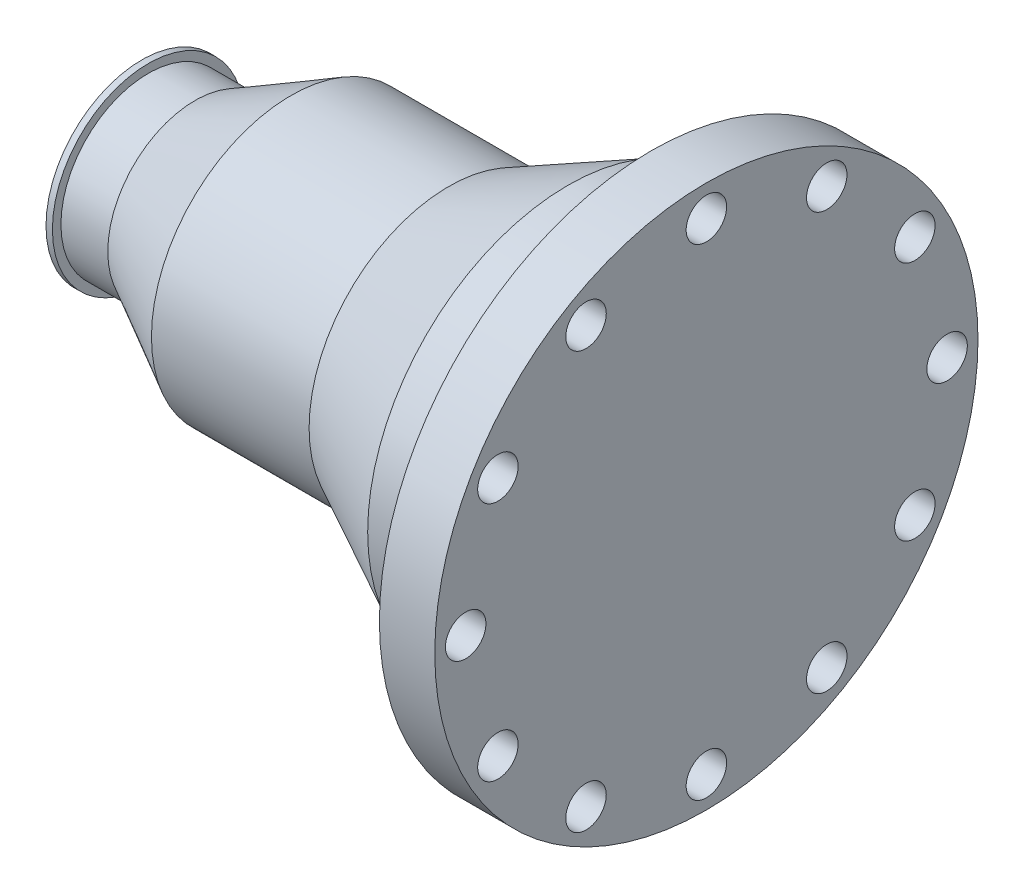
ISO-10303-21;
HEADER;
FILE_DESCRIPTION(('STEP AP214'),'2;1');
FILE_NAME('part.step','',(''),(''),'','','');
FILE_SCHEMA(('AUTOMOTIVE_DESIGN { 1 0 10303 214 1 1 1 1 }'));
ENDSEC;
DATA;
#1=APPLICATION_CONTEXT('core data for automotive mechanical design processes');
#2=APPLICATION_PROTOCOL_DEFINITION('international standard','automotive_design',2000,#1);
#3=PRODUCT_CONTEXT('',#1,'mechanical');
#4=PRODUCT('Part','Part','',(#3));
#5=PRODUCT_RELATED_PRODUCT_CATEGORY('part','',(#4));
#6=PRODUCT_DEFINITION_FORMATION('','',#4);
#7=PRODUCT_DEFINITION_CONTEXT('part definition',#1,'design');
#8=PRODUCT_DEFINITION('design','',#6,#7);
#9=PRODUCT_DEFINITION_SHAPE('','',#8);
#10=(LENGTH_UNIT() NAMED_UNIT(*) SI_UNIT(.MILLI.,.METRE.));
#11=(NAMED_UNIT(*) PLANE_ANGLE_UNIT() SI_UNIT($,.RADIAN.));
#12=(NAMED_UNIT(*) SI_UNIT($,.STERADIAN.) SOLID_ANGLE_UNIT());
#13=UNCERTAINTY_MEASURE_WITH_UNIT(LENGTH_MEASURE(1.E-05),#10,'distance_accuracy_value','');
#14=(GEOMETRIC_REPRESENTATION_CONTEXT(3) GLOBAL_UNCERTAINTY_ASSIGNED_CONTEXT((#13)) GLOBAL_UNIT_ASSIGNED_CONTEXT((#10,
#11,#12)) REPRESENTATION_CONTEXT('',''));
#15=CARTESIAN_POINT('',(0.,0.,0.));
#16=DIRECTION('',(0.,0.,1.));
#17=DIRECTION('',(1.,0.,0.));
#18=AXIS2_PLACEMENT_3D('',#15,#16,#17);
#19=CARTESIAN_POINT('',(0.,0.,0.));
#20=DIRECTION('',(1.,0.,0.));
#21=DIRECTION('',(0.,0.,-1.));
#22=AXIS2_PLACEMENT_3D('',#19,#20,#21);
#23=PLANE('',#22);
#24=CARTESIAN_POINT('',(0.,0.,0.));
#25=DIRECTION('',(-1.,0.,0.));
#26=DIRECTION('',(0.,0.,1.));
#27=AXIS2_PLACEMENT_3D('',#24,#25,#26);
#28=CIRCLE('',#27,31.);
#29=CARTESIAN_POINT('',(0.,0.,31.));
#30=VERTEX_POINT('',#29);
#31=EDGE_CURVE('E80',#30,#30,#28,.T.);
#32=ORIENTED_EDGE('',*,*,#31,.F.);
#33=EDGE_LOOP('',(#32));
#34=FACE_BOUND('',#33,.T.);
#35=CARTESIAN_POINT('',(0.,0.,0.));
#36=DIRECTION('',(-1.,0.,0.));
#37=DIRECTION('',(0.,0.,1.));
#38=AXIS2_PLACEMENT_3D('',#35,#36,#37);
#39=CIRCLE('',#38,45.);
#40=CARTESIAN_POINT('',(0.,0.,45.));
#41=VERTEX_POINT('',#40);
#42=EDGE_CURVE('E10',#41,#41,#39,.T.);
#43=ORIENTED_EDGE('',*,*,#42,.T.);
#44=EDGE_LOOP('',(#43));
#45=FACE_BOUND('',#44,.T.);
#46=ADVANCED_FACE('F37',(#34,#45),#23,.F.);
#47=CARTESIAN_POINT('',(0.,0.,0.));
#48=DIRECTION('',(-1.,0.,0.));
#49=DIRECTION('',(0.,0.,1.));
#50=AXIS2_PLACEMENT_3D('',#47,#48,#49);
#51=CYLINDRICAL_SURFACE('',#50,45.);
#52=ORIENTED_EDGE('',*,*,#42,.F.);
#53=EDGE_LOOP('',(#52));
#54=FACE_BOUND('',#53,.T.);
#55=CARTESIAN_POINT('',(3.,0.,0.));
#56=DIRECTION('',(-1.,0.,0.));
#57=DIRECTION('',(0.,0.,1.));
#58=AXIS2_PLACEMENT_3D('',#55,#56,#57);
#59=CIRCLE('',#58,45.);
#60=CARTESIAN_POINT('',(3.,0.,45.));
#61=VERTEX_POINT('',#60);
#62=EDGE_CURVE('E43',#61,#61,#59,.T.);
#63=ORIENTED_EDGE('',*,*,#62,.T.);
#64=EDGE_LOOP('',(#63));
#65=FACE_BOUND('',#64,.T.);
#66=ADVANCED_FACE('F226',(#54,#65),#51,.T.);
#67=CARTESIAN_POINT('',(3.,45.,0.));
#68=DIRECTION('',(-1.,0.,0.));
#69=DIRECTION('',(0.,0.,1.));
#70=AXIS2_PLACEMENT_3D('',#67,#68,#69);
#71=PLANE('',#70);
#72=ORIENTED_EDGE('',*,*,#62,.F.);
#73=EDGE_LOOP('',(#72));
#74=FACE_BOUND('',#73,.T.);
#75=CARTESIAN_POINT('',(3.,0.,0.));
#76=DIRECTION('',(-1.,0.,0.));
#77=DIRECTION('',(0.,0.,1.));
#78=AXIS2_PLACEMENT_3D('',#75,#76,#77);
#79=CIRCLE('',#78,41.);
#80=CARTESIAN_POINT('',(3.,0.,41.));
#81=VERTEX_POINT('',#80);
#82=EDGE_CURVE('E47',#81,#81,#79,.T.);
#83=ORIENTED_EDGE('',*,*,#82,.T.);
#84=EDGE_LOOP('',(#83));
#85=FACE_BOUND('',#84,.T.);
#86=ADVANCED_FACE('F232',(#74,#85),#71,.F.);
#87=CARTESIAN_POINT('',(0.,0.,0.));
#88=DIRECTION('',(-1.,0.,0.));
#89=DIRECTION('',(0.,0.,1.));
#90=AXIS2_PLACEMENT_3D('',#87,#88,#89);
#91=CYLINDRICAL_SURFACE('',#90,41.);
#92=ORIENTED_EDGE('',*,*,#82,.F.);
#93=EDGE_LOOP('',(#92));
#94=FACE_BOUND('',#93,.T.);
#95=CARTESIAN_POINT('',(25.,0.,0.));
#96=DIRECTION('',(-1.,0.,0.));
#97=DIRECTION('',(0.,0.,1.));
#98=AXIS2_PLACEMENT_3D('',#95,#96,#97);
#99=CIRCLE('',#98,41.);
#100=CARTESIAN_POINT('',(25.,0.,41.));
#101=VERTEX_POINT('',#100);
#102=EDGE_CURVE('E51',#101,#101,#99,.T.);
#103=ORIENTED_EDGE('',*,*,#102,.T.);
#104=EDGE_LOOP('',(#103));
#105=FACE_BOUND('',#104,.T.);
#106=ADVANCED_FACE('F514',(#94,#105),#91,.T.);
#107=CARTESIAN_POINT('',(70.,0.,0.));
#108=DIRECTION('',(1.,0.,0.));
#109=DIRECTION('',(0.,0.,-1.));
#110=AXIS2_PLACEMENT_3D('',#107,#108,#109);
#111=CONICAL_SURFACE('',#110,65.5,0.498567905638218);
#112=ORIENTED_EDGE('',*,*,#102,.F.);
#113=EDGE_LOOP('',(#112));
#114=FACE_BOUND('',#113,.T.);
#115=CARTESIAN_POINT('',(70.,0.,0.));
#116=DIRECTION('',(-1.,0.,0.));
#117=DIRECTION('',(0.,0.,1.));
#118=AXIS2_PLACEMENT_3D('',#115,#116,#117);
#119=CIRCLE('',#118,65.5);
#120=CARTESIAN_POINT('',(70.,0.,65.5));
#121=VERTEX_POINT('',#120);
#122=EDGE_CURVE('E56',#121,#121,#119,.T.);
#123=ORIENTED_EDGE('',*,*,#122,.T.);
#124=EDGE_LOOP('',(#123));
#125=FACE_BOUND('',#124,.T.);
#126=ADVANCED_FACE('F505',(#114,#125),#111,.T.);
#127=CARTESIAN_POINT('',(0.,0.,0.));
#128=DIRECTION('',(-1.,0.,0.));
#129=DIRECTION('',(0.,0.,1.));
#130=AXIS2_PLACEMENT_3D('',#127,#128,#129);
#131=CYLINDRICAL_SURFACE('',#130,65.5);
#132=ORIENTED_EDGE('',*,*,#122,.F.);
#133=EDGE_LOOP('',(#132));
#134=FACE_BOUND('',#133,.T.);
#135=CARTESIAN_POINT('',(144.,0.,0.));
#136=DIRECTION('',(-1.,0.,0.));
#137=DIRECTION('',(0.,0.,1.));
#138=AXIS2_PLACEMENT_3D('',#135,#136,#137);
#139=CIRCLE('',#138,65.5);
#140=CARTESIAN_POINT('',(144.,0.,65.5));
#141=VERTEX_POINT('',#140);
#142=EDGE_CURVE('E59',#141,#141,#139,.T.);
#143=ORIENTED_EDGE('',*,*,#142,.T.);
#144=EDGE_LOOP('',(#143));
#145=FACE_BOUND('',#144,.T.);
#146=ADVANCED_FACE('F496',(#134,#145),#131,.T.);
#147=CARTESIAN_POINT('',(200.,0.,0.));
#148=DIRECTION('',(1.,0.,0.));
#149=DIRECTION('',(0.,0.,-1.));
#150=AXIS2_PLACEMENT_3D('',#147,#148,#149);
#151=CONICAL_SURFACE('',#150,94.,0.470764926542016);
#152=ORIENTED_EDGE('',*,*,#142,.F.);
#153=EDGE_LOOP('',(#152));
#154=FACE_BOUND('',#153,.T.);
#155=CARTESIAN_POINT('',(200.,0.,0.));
#156=DIRECTION('',(-1.,0.,0.));
#157=DIRECTION('',(0.,0.,1.));
#158=AXIS2_PLACEMENT_3D('',#155,#156,#157);
#159=CIRCLE('',#158,94.);
#160=CARTESIAN_POINT('',(200.,0.,94.));
#161=VERTEX_POINT('',#160);
#162=EDGE_CURVE('E62',#161,#161,#159,.T.);
#163=ORIENTED_EDGE('',*,*,#162,.T.);
#164=EDGE_LOOP('',(#163));
#165=FACE_BOUND('',#164,.T.);
#166=ADVANCED_FACE('F487',(#154,#165),#151,.T.);
#167=CARTESIAN_POINT('',(0.,0.,0.));
#168=DIRECTION('',(-1.,0.,0.));
#169=DIRECTION('',(0.,0.,1.));
#170=AXIS2_PLACEMENT_3D('',#167,#168,#169);
#171=CYLINDRICAL_SURFACE('',#170,94.);
#172=ORIENTED_EDGE('',*,*,#162,.F.);
#173=EDGE_LOOP('',(#172));
#174=FACE_BOUND('',#173,.T.);
#175=CARTESIAN_POINT('',(220.,0.,0.));
#176=DIRECTION('',(-1.,0.,0.));
#177=DIRECTION('',(0.,0.,1.));
#178=AXIS2_PLACEMENT_3D('',#175,#176,#177);
#179=CIRCLE('',#178,94.);
#180=CARTESIAN_POINT('',(220.,0.,94.));
#181=VERTEX_POINT('',#180);
#182=EDGE_CURVE('E65',#181,#181,#179,.T.);
#183=ORIENTED_EDGE('',*,*,#182,.T.);
#184=EDGE_LOOP('',(#183));
#185=FACE_BOUND('',#184,.T.);
#186=ADVANCED_FACE('F478',(#174,#185),#171,.T.);
#187=CARTESIAN_POINT('',(220.,94.,0.));
#188=DIRECTION('',(1.,0.,0.));
#189=DIRECTION('',(0.,0.,-1.));
#190=AXIS2_PLACEMENT_3D('',#187,#188,#189);
#191=PLANE('',#190);
#192=ORIENTED_EDGE('',*,*,#182,.F.);
#193=EDGE_LOOP('',(#192));
#194=FACE_BOUND('',#193,.T.);
#195=CARTESIAN_POINT('',(220.,0.,0.));
#196=DIRECTION('',(-1.,0.,0.));
#197=DIRECTION('',(0.,0.,1.));
#198=AXIS2_PLACEMENT_3D('',#195,#196,#197);
#199=CIRCLE('',#198,95.);
#200=CARTESIAN_POINT('',(220.,0.,95.));
#201=VERTEX_POINT('',#200);
#202=EDGE_CURVE('E68',#201,#201,#199,.T.);
#203=ORIENTED_EDGE('',*,*,#202,.T.);
#204=EDGE_LOOP('',(#203));
#205=FACE_BOUND('',#204,.T.);
#206=ADVANCED_FACE('F469',(#194,#205),#191,.F.);
#207=CARTESIAN_POINT('',(0.,0.,0.));
#208=DIRECTION('',(-1.,0.,0.));
#209=DIRECTION('',(0.,0.,1.));
#210=AXIS2_PLACEMENT_3D('',#207,#208,#209);
#211=CYLINDRICAL_SURFACE('',#210,95.);
#212=ORIENTED_EDGE('',*,*,#202,.F.);
#213=EDGE_LOOP('',(#212));
#214=FACE_BOUND('',#213,.T.);
#215=CARTESIAN_POINT('',(239.,0.,0.));
#216=DIRECTION('',(-1.,0.,0.));
#217=DIRECTION('',(0.,0.,1.));
#218=AXIS2_PLACEMENT_3D('',#215,#216,#217);
#219=CIRCLE('',#218,95.);
#220=CARTESIAN_POINT('',(239.,0.,95.));
#221=VERTEX_POINT('',#220);
#222=EDGE_CURVE('E71',#221,#221,#219,.T.);
#223=ORIENTED_EDGE('',*,*,#222,.T.);
#224=EDGE_LOOP('',(#223));
#225=FACE_BOUND('',#224,.T.);
#226=ADVANCED_FACE('F222',(#214,#225),#211,.T.);
#227=CARTESIAN_POINT('',(239.,100.,0.));
#228=DIRECTION('',(1.,0.,0.));
#229=DIRECTION('',(0.,0.,-1.));
#230=AXIS2_PLACEMENT_3D('',#227,#228,#229);
#231=PLANE('',#230);
#232=CARTESIAN_POINT('',(239.,97.8608706276416,-56.5));
#233=DIRECTION('',(1.,0.,0.));
#234=DIRECTION('',(0.,0.,-1.));
#235=AXIS2_PLACEMENT_3D('',#232,#233,#234);
#236=CIRCLE('',#235,9.50000000000001);
#237=CARTESIAN_POINT('',(239.,97.8608706276416,-66.));
#238=VERTEX_POINT('',#237);
#239=EDGE_CURVE('E173',#238,#238,#236,.F.);
#240=ORIENTED_EDGE('',*,*,#239,.F.);
#241=EDGE_LOOP('',(#240));
#242=FACE_BOUND('',#241,.T.);
#243=CARTESIAN_POINT('',(239.,56.4999999999999,-97.8608706276416));
#244=DIRECTION('',(1.,0.,0.));
#245=DIRECTION('',(0.,0.,-1.));
#246=AXIS2_PLACEMENT_3D('',#243,#244,#245);
#247=CIRCLE('',#246,9.5);
#248=CARTESIAN_POINT('',(239.,56.4999999999999,-107.360870627642));
#249=VERTEX_POINT('',#248);
#250=EDGE_CURVE('E167',#249,#249,#247,.F.);
#251=ORIENTED_EDGE('',*,*,#250,.F.);
#252=EDGE_LOOP('',(#251));
#253=FACE_BOUND('',#252,.T.);
#254=CARTESIAN_POINT('',(239.,0.,-113.));
#255=DIRECTION('',(1.,0.,0.));
#256=DIRECTION('',(0.,0.,-1.));
#257=AXIS2_PLACEMENT_3D('',#254,#255,#256);
#258=CIRCLE('',#257,9.49999999999999);
#259=CARTESIAN_POINT('',(239.,0.,-122.5));
#260=VERTEX_POINT('',#259);
#261=EDGE_CURVE('E161',#260,#260,#258,.F.);
#262=ORIENTED_EDGE('',*,*,#261,.F.);
#263=EDGE_LOOP('',(#262));
#264=FACE_BOUND('',#263,.T.);
#265=CARTESIAN_POINT('',(239.,-56.5,-97.8608706276415));
#266=DIRECTION('',(1.,0.,0.));
#267=DIRECTION('',(0.,0.,-1.));
#268=AXIS2_PLACEMENT_3D('',#265,#266,#267);
#269=CIRCLE('',#268,9.5);
#270=CARTESIAN_POINT('',(239.,-56.5,-107.360870627642));
#271=VERTEX_POINT('',#270);
#272=EDGE_CURVE('E155',#271,#271,#269,.F.);
#273=ORIENTED_EDGE('',*,*,#272,.F.);
#274=EDGE_LOOP('',(#273));
#275=FACE_BOUND('',#274,.T.);
#276=CARTESIAN_POINT('',(239.,-97.8608706276416,-56.5));
#277=DIRECTION('',(1.,0.,0.));
#278=DIRECTION('',(0.,0.,-1.));
#279=AXIS2_PLACEMENT_3D('',#276,#277,#278);
#280=CIRCLE('',#279,9.50000000000001);
#281=CARTESIAN_POINT('',(239.,-97.8608706276416,-66.));
#282=VERTEX_POINT('',#281);
#283=EDGE_CURVE('E149',#282,#282,#280,.F.);
#284=ORIENTED_EDGE('',*,*,#283,.F.);
#285=EDGE_LOOP('',(#284));
#286=FACE_BOUND('',#285,.T.);
#287=CARTESIAN_POINT('',(239.,-113.,0.));
#288=DIRECTION('',(1.,0.,0.));
#289=DIRECTION('',(0.,0.,-1.));
#290=AXIS2_PLACEMENT_3D('',#287,#288,#289);
#291=CIRCLE('',#290,9.49999999999998);
#292=CARTESIAN_POINT('',(239.,-113.,-9.49999999999998));
#293=VERTEX_POINT('',#292);
#294=EDGE_CURVE('E143',#293,#293,#291,.F.);
#295=ORIENTED_EDGE('',*,*,#294,.F.);
#296=EDGE_LOOP('',(#295));
#297=FACE_BOUND('',#296,.T.);
#298=CARTESIAN_POINT('',(239.,-97.8608706276415,56.5));
#299=DIRECTION('',(1.,0.,0.));
#300=DIRECTION('',(0.,0.,-1.));
#301=AXIS2_PLACEMENT_3D('',#298,#299,#300);
#302=CIRCLE('',#301,9.5);
#303=CARTESIAN_POINT('',(239.,-97.8608706276415,47.));
#304=VERTEX_POINT('',#303);
#305=EDGE_CURVE('E137',#304,#304,#302,.F.);
#306=ORIENTED_EDGE('',*,*,#305,.F.);
#307=EDGE_LOOP('',(#306));
#308=FACE_BOUND('',#307,.T.);
#309=CARTESIAN_POINT('',(239.,-56.5,97.8608706276416));
#310=DIRECTION('',(1.,0.,0.));
#311=DIRECTION('',(0.,0.,-1.));
#312=AXIS2_PLACEMENT_3D('',#309,#310,#311);
#313=CIRCLE('',#312,9.5);
#314=CARTESIAN_POINT('',(239.,-56.5,88.3608706276416));
#315=VERTEX_POINT('',#314);
#316=EDGE_CURVE('E131',#315,#315,#313,.F.);
#317=ORIENTED_EDGE('',*,*,#316,.F.);
#318=EDGE_LOOP('',(#317));
#319=FACE_BOUND('',#318,.T.);
#320=CARTESIAN_POINT('',(239.,0.,113.));
#321=DIRECTION('',(1.,0.,0.));
#322=DIRECTION('',(0.,0.,-1.));
#323=AXIS2_PLACEMENT_3D('',#320,#321,#322);
#324=CIRCLE('',#323,9.49999999999999);
#325=CARTESIAN_POINT('',(239.,0.,103.5));
#326=VERTEX_POINT('',#325);
#327=EDGE_CURVE('E125',#326,#326,#324,.F.);
#328=ORIENTED_EDGE('',*,*,#327,.F.);
#329=EDGE_LOOP('',(#328));
#330=FACE_BOUND('',#329,.T.);
#331=CARTESIAN_POINT('',(239.,56.5,97.8608706276416));
#332=DIRECTION('',(1.,0.,0.));
#333=DIRECTION('',(0.,0.,-1.));
#334=AXIS2_PLACEMENT_3D('',#331,#332,#333);
#335=CIRCLE('',#334,9.5);
#336=CARTESIAN_POINT('',(239.,56.5,88.3608706276416));
#337=VERTEX_POINT('',#336);
#338=EDGE_CURVE('E119',#337,#337,#335,.F.);
#339=ORIENTED_EDGE('',*,*,#338,.F.);
#340=EDGE_LOOP('',(#339));
#341=FACE_BOUND('',#340,.T.);
#342=CARTESIAN_POINT('',(239.,97.8608706276416,56.5));
#343=DIRECTION('',(1.,0.,0.));
#344=DIRECTION('',(0.,0.,-1.));
#345=AXIS2_PLACEMENT_3D('',#342,#343,#344);
#346=CIRCLE('',#345,9.5);
#347=CARTESIAN_POINT('',(239.,97.8608706276416,47.));
#348=VERTEX_POINT('',#347);
#349=EDGE_CURVE('E113',#348,#348,#346,.F.);
#350=ORIENTED_EDGE('',*,*,#349,.F.);
#351=EDGE_LOOP('',(#350));
#352=FACE_BOUND('',#351,.T.);
#353=CARTESIAN_POINT('',(239.,113.,0.));
#354=DIRECTION('',(1.,0.,0.));
#355=DIRECTION('',(0.,0.,-1.));
#356=AXIS2_PLACEMENT_3D('',#353,#354,#355);
#357=CIRCLE('',#356,9.50000000000001);
#358=CARTESIAN_POINT('',(239.,113.,-9.50000000000001));
#359=VERTEX_POINT('',#358);
#360=EDGE_CURVE('E107',#359,#359,#357,.F.);
#361=ORIENTED_EDGE('',*,*,#360,.F.);
#362=EDGE_LOOP('',(#361));
#363=FACE_BOUND('',#362,.T.);
#364=ORIENTED_EDGE('',*,*,#222,.F.);
#365=EDGE_LOOP('',(#364));
#366=FACE_BOUND('',#365,.T.);
#367=CARTESIAN_POINT('',(239.,0.,0.));
#368=DIRECTION('',(-1.,0.,0.));
#369=DIRECTION('',(0.,0.,1.));
#370=AXIS2_PLACEMENT_3D('',#367,#368,#369);
#371=CIRCLE('',#370,127.5);
#372=CARTESIAN_POINT('',(239.,0.,127.5));
#373=VERTEX_POINT('',#372);
#374=EDGE_CURVE('E74',#373,#373,#371,.T.);
#375=ORIENTED_EDGE('',*,*,#374,.T.);
#376=EDGE_LOOP('',(#375));
#377=FACE_BOUND('',#376,.T.);
#378=ADVANCED_FACE('F214',(#242,#253,#264,#275,#286,#297,#308,#319,#330,#341,#352,#363,#366,
#377),#231,.F.);
#379=CARTESIAN_POINT('',(0.,0.,0.));
#380=DIRECTION('',(-1.,0.,0.));
#381=DIRECTION('',(0.,0.,1.));
#382=AXIS2_PLACEMENT_3D('',#379,#380,#381);
#383=CYLINDRICAL_SURFACE('',#382,127.5);
#384=ORIENTED_EDGE('',*,*,#374,.F.);
#385=EDGE_LOOP('',(#384));
#386=FACE_BOUND('',#385,.T.);
#387=CARTESIAN_POINT('',(265.,0.,0.));
#388=DIRECTION('',(-1.,0.,0.));
#389=DIRECTION('',(0.,0.,1.));
#390=AXIS2_PLACEMENT_3D('',#387,#388,#389);
#391=CIRCLE('',#390,127.5);
#392=CARTESIAN_POINT('',(265.,0.,127.5));
#393=VERTEX_POINT('',#392);
#394=EDGE_CURVE('E77',#393,#393,#391,.T.);
#395=ORIENTED_EDGE('',*,*,#394,.T.);
#396=EDGE_LOOP('',(#395));
#397=FACE_BOUND('',#396,.T.);
#398=ADVANCED_FACE('F187',(#386,#397),#383,.T.);
#399=CARTESIAN_POINT('',(265.,127.5,0.));
#400=DIRECTION('',(-1.,0.,0.));
#401=DIRECTION('',(0.,0.,1.));
#402=AXIS2_PLACEMENT_3D('',#399,#400,#401);
#403=PLANE('',#402);
#404=CARTESIAN_POINT('',(265.,97.8608706276416,-56.5));
#405=DIRECTION('',(1.,0.,0.));
#406=DIRECTION('',(0.,0.,-1.));
#407=AXIS2_PLACEMENT_3D('',#404,#405,#406);
#408=CIRCLE('',#407,9.50000000000001);
#409=CARTESIAN_POINT('',(265.,97.8608706276416,-66.));
#410=VERTEX_POINT('',#409);
#411=EDGE_CURVE('E176',#410,#410,#408,.T.);
#412=ORIENTED_EDGE('',*,*,#411,.F.);
#413=EDGE_LOOP('',(#412));
#414=FACE_BOUND('',#413,.T.);
#415=CARTESIAN_POINT('',(265.,56.4999999999999,-97.8608706276416));
#416=DIRECTION('',(1.,0.,0.));
#417=DIRECTION('',(0.,0.,-1.));
#418=AXIS2_PLACEMENT_3D('',#415,#416,#417);
#419=CIRCLE('',#418,9.5);
#420=CARTESIAN_POINT('',(265.,56.4999999999999,-107.360870627642));
#421=VERTEX_POINT('',#420);
#422=EDGE_CURVE('E170',#421,#421,#419,.T.);
#423=ORIENTED_EDGE('',*,*,#422,.F.);
#424=EDGE_LOOP('',(#423));
#425=FACE_BOUND('',#424,.T.);
#426=CARTESIAN_POINT('',(265.,0.,-113.));
#427=DIRECTION('',(1.,0.,0.));
#428=DIRECTION('',(0.,0.,-1.));
#429=AXIS2_PLACEMENT_3D('',#426,#427,#428);
#430=CIRCLE('',#429,9.49999999999999);
#431=CARTESIAN_POINT('',(265.,0.,-122.5));
#432=VERTEX_POINT('',#431);
#433=EDGE_CURVE('E164',#432,#432,#430,.T.);
#434=ORIENTED_EDGE('',*,*,#433,.F.);
#435=EDGE_LOOP('',(#434));
#436=FACE_BOUND('',#435,.T.);
#437=CARTESIAN_POINT('',(265.,-56.5,-97.8608706276415));
#438=DIRECTION('',(1.,0.,0.));
#439=DIRECTION('',(0.,0.,-1.));
#440=AXIS2_PLACEMENT_3D('',#437,#438,#439);
#441=CIRCLE('',#440,9.5);
#442=CARTESIAN_POINT('',(265.,-56.5,-107.360870627642));
#443=VERTEX_POINT('',#442);
#444=EDGE_CURVE('E158',#443,#443,#441,.T.);
#445=ORIENTED_EDGE('',*,*,#444,.F.);
#446=EDGE_LOOP('',(#445));
#447=FACE_BOUND('',#446,.T.);
#448=CARTESIAN_POINT('',(265.,-97.8608706276416,-56.5));
#449=DIRECTION('',(1.,0.,0.));
#450=DIRECTION('',(0.,0.,-1.));
#451=AXIS2_PLACEMENT_3D('',#448,#449,#450);
#452=CIRCLE('',#451,9.50000000000001);
#453=CARTESIAN_POINT('',(265.,-97.8608706276416,-66.));
#454=VERTEX_POINT('',#453);
#455=EDGE_CURVE('E152',#454,#454,#452,.T.);
#456=ORIENTED_EDGE('',*,*,#455,.F.);
#457=EDGE_LOOP('',(#456));
#458=FACE_BOUND('',#457,.T.);
#459=CARTESIAN_POINT('',(265.,-113.,0.));
#460=DIRECTION('',(1.,0.,0.));
#461=DIRECTION('',(0.,0.,-1.));
#462=AXIS2_PLACEMENT_3D('',#459,#460,#461);
#463=CIRCLE('',#462,9.49999999999998);
#464=CARTESIAN_POINT('',(265.,-113.,-9.49999999999998));
#465=VERTEX_POINT('',#464);
#466=EDGE_CURVE('E146',#465,#465,#463,.T.);
#467=ORIENTED_EDGE('',*,*,#466,.F.);
#468=EDGE_LOOP('',(#467));
#469=FACE_BOUND('',#468,.T.);
#470=CARTESIAN_POINT('',(265.,-97.8608706276415,56.5));
#471=DIRECTION('',(1.,0.,0.));
#472=DIRECTION('',(0.,0.,-1.));
#473=AXIS2_PLACEMENT_3D('',#470,#471,#472);
#474=CIRCLE('',#473,9.5);
#475=CARTESIAN_POINT('',(265.,-97.8608706276415,47.));
#476=VERTEX_POINT('',#475);
#477=EDGE_CURVE('E140',#476,#476,#474,.T.);
#478=ORIENTED_EDGE('',*,*,#477,.F.);
#479=EDGE_LOOP('',(#478));
#480=FACE_BOUND('',#479,.T.);
#481=CARTESIAN_POINT('',(265.,-56.5,97.8608706276416));
#482=DIRECTION('',(1.,0.,0.));
#483=DIRECTION('',(0.,0.,-1.));
#484=AXIS2_PLACEMENT_3D('',#481,#482,#483);
#485=CIRCLE('',#484,9.5);
#486=CARTESIAN_POINT('',(265.,-56.5,88.3608706276416));
#487=VERTEX_POINT('',#486);
#488=EDGE_CURVE('E134',#487,#487,#485,.T.);
#489=ORIENTED_EDGE('',*,*,#488,.F.);
#490=EDGE_LOOP('',(#489));
#491=FACE_BOUND('',#490,.T.);
#492=CARTESIAN_POINT('',(265.,0.,113.));
#493=DIRECTION('',(1.,0.,0.));
#494=DIRECTION('',(0.,0.,-1.));
#495=AXIS2_PLACEMENT_3D('',#492,#493,#494);
#496=CIRCLE('',#495,9.49999999999999);
#497=CARTESIAN_POINT('',(265.,0.,103.5));
#498=VERTEX_POINT('',#497);
#499=EDGE_CURVE('E128',#498,#498,#496,.T.);
#500=ORIENTED_EDGE('',*,*,#499,.F.);
#501=EDGE_LOOP('',(#500));
#502=FACE_BOUND('',#501,.T.);
#503=CARTESIAN_POINT('',(265.,56.5,97.8608706276416));
#504=DIRECTION('',(1.,0.,0.));
#505=DIRECTION('',(0.,0.,-1.));
#506=AXIS2_PLACEMENT_3D('',#503,#504,#505);
#507=CIRCLE('',#506,9.5);
#508=CARTESIAN_POINT('',(265.,56.5,88.3608706276416));
#509=VERTEX_POINT('',#508);
#510=EDGE_CURVE('E122',#509,#509,#507,.T.);
#511=ORIENTED_EDGE('',*,*,#510,.F.);
#512=EDGE_LOOP('',(#511));
#513=FACE_BOUND('',#512,.T.);
#514=CARTESIAN_POINT('',(265.,97.8608706276416,56.5));
#515=DIRECTION('',(1.,0.,0.));
#516=DIRECTION('',(0.,0.,-1.));
#517=AXIS2_PLACEMENT_3D('',#514,#515,#516);
#518=CIRCLE('',#517,9.5);
#519=CARTESIAN_POINT('',(265.,97.8608706276416,47.));
#520=VERTEX_POINT('',#519);
#521=EDGE_CURVE('E116',#520,#520,#518,.T.);
#522=ORIENTED_EDGE('',*,*,#521,.F.);
#523=EDGE_LOOP('',(#522));
#524=FACE_BOUND('',#523,.T.);
#525=CARTESIAN_POINT('',(265.,113.,0.));
#526=DIRECTION('',(1.,0.,0.));
#527=DIRECTION('',(0.,0.,-1.));
#528=AXIS2_PLACEMENT_3D('',#525,#526,#527);
#529=CIRCLE('',#528,9.50000000000001);
#530=CARTESIAN_POINT('',(265.,113.,-9.50000000000001));
#531=VERTEX_POINT('',#530);
#532=EDGE_CURVE('E110',#531,#531,#529,.T.);
#533=ORIENTED_EDGE('',*,*,#532,.F.);
#534=EDGE_LOOP('',(#533));
#535=FACE_BOUND('',#534,.T.);
#536=ORIENTED_EDGE('',*,*,#394,.F.);
#537=EDGE_LOOP('',(#536));
#538=FACE_BOUND('',#537,.T.);
#539=ADVANCED_FACE('F183',(#414,#425,#436,#447,#458,#469,#480,#491,#502,#513,#524,#535,#538),
#403,.F.);
#540=CARTESIAN_POINT('',(0.,0.,0.));
#541=DIRECTION('',(-1.,0.,0.));
#542=DIRECTION('',(0.,0.,1.));
#543=AXIS2_PLACEMENT_3D('',#540,#541,#542);
#544=CYLINDRICAL_SURFACE('',#543,31.);
#545=ORIENTED_EDGE('',*,*,#31,.T.);
#546=EDGE_LOOP('',(#545));
#547=FACE_BOUND('',#546,.T.);
#548=CARTESIAN_POINT('',(42.,0.,0.));
#549=DIRECTION('',(-1.,0.,0.));
#550=DIRECTION('',(0.,0.,1.));
#551=AXIS2_PLACEMENT_3D('',#548,#549,#550);
#552=CIRCLE('',#551,31.);
#553=CARTESIAN_POINT('',(42.,0.,31.));
#554=VERTEX_POINT('',#553);
#555=EDGE_CURVE('E83',#554,#554,#552,.T.);
#556=ORIENTED_EDGE('',*,*,#555,.F.);
#557=EDGE_LOOP('',(#556));
#558=FACE_BOUND('',#557,.T.);
#559=ADVANCED_FACE('F186',(#547,#558),#544,.F.);
#560=CARTESIAN_POINT('',(70.,0.,0.));
#561=DIRECTION('',(1.,0.,0.));
#562=DIRECTION('',(0.,0.,-1.));
#563=AXIS2_PLACEMENT_3D('',#560,#561,#562);
#564=CONICAL_SURFACE('',#563,38.502577,0.261799374867879);
#565=ORIENTED_EDGE('',*,*,#555,.T.);
#566=EDGE_LOOP('',(#565));
#567=FACE_BOUND('',#566,.T.);
#568=CARTESIAN_POINT('',(70.,0.,0.));
#569=DIRECTION('',(-1.,0.,0.));
#570=DIRECTION('',(0.,0.,1.));
#571=AXIS2_PLACEMENT_3D('',#568,#569,#570);
#572=CIRCLE('',#571,38.502577);
#573=CARTESIAN_POINT('',(70.,0.,38.502577));
#574=VERTEX_POINT('',#573);
#575=EDGE_CURVE('E86',#574,#574,#572,.T.);
#576=ORIENTED_EDGE('',*,*,#575,.F.);
#577=EDGE_LOOP('',(#576));
#578=FACE_BOUND('',#577,.T.);
#579=ADVANCED_FACE('F237',(#567,#578),#564,.F.);
#580=CARTESIAN_POINT('',(107.802202951022,0.,0.));
#581=DIRECTION('',(-1.,0.,0.));
#582=DIRECTION('',(0.,0.,1.));
#583=AXIS2_PLACEMENT_3D('',#580,#581,#582);
#584=DEGENERATE_TOROIDAL_SURFACE('',#583,5.77654352226822,49.9999981513586,.T.);
#585=ORIENTED_EDGE('',*,*,#575,.T.);
#586=EDGE_LOOP('',(#585));
#587=FACE_BOUND('',#586,.T.);
#588=CARTESIAN_POINT('',(90.,0.,0.));
#589=DIRECTION('',(-1.,0.,0.));
#590=DIRECTION('',(0.,0.,1.));
#591=AXIS2_PLACEMENT_3D('',#588,#589,#590);
#592=CIRCLE('',#591,52.5);
#593=CARTESIAN_POINT('',(90.,0.,52.5));
#594=VERTEX_POINT('',#593);
#595=EDGE_CURVE('E89',#594,#594,#592,.T.);
#596=ORIENTED_EDGE('',*,*,#595,.F.);
#597=EDGE_LOOP('',(#596));
#598=FACE_BOUND('',#597,.T.);
#599=ADVANCED_FACE('F243',(#587,#598),#584,.F.);
#600=CARTESIAN_POINT('',(0.,0.,0.));
#601=DIRECTION('',(-1.,0.,0.));
#602=DIRECTION('',(0.,0.,1.));
#603=AXIS2_PLACEMENT_3D('',#600,#601,#602);
#604=CYLINDRICAL_SURFACE('',#603,52.5);
#605=ORIENTED_EDGE('',*,*,#595,.T.);
#606=EDGE_LOOP('',(#605));
#607=FACE_BOUND('',#606,.T.);
#608=CARTESIAN_POINT('',(142.,0.,0.));
#609=DIRECTION('',(-1.,0.,0.));
#610=DIRECTION('',(0.,0.,1.));
#611=AXIS2_PLACEMENT_3D('',#608,#609,#610);
#612=CIRCLE('',#611,52.5);
#613=CARTESIAN_POINT('',(142.,0.,52.5));
#614=VERTEX_POINT('',#613);
#615=EDGE_CURVE('E92',#614,#614,#612,.T.);
#616=ORIENTED_EDGE('',*,*,#615,.F.);
#617=EDGE_LOOP('',(#616));
#618=FACE_BOUND('',#617,.T.);
#619=ADVANCED_FACE('F249',(#607,#618),#604,.F.);
#620=CARTESIAN_POINT('',(142.75,0.,0.));
#621=DIRECTION('',(-1.,0.,0.));
#622=DIRECTION('',(0.,0.,1.));
#623=AXIS2_PLACEMENT_3D('',#620,#621,#622);
#624=TOROIDAL_SURFACE('',#623,49.8031848031275,2.79916276877255);
#625=ORIENTED_EDGE('',*,*,#615,.T.);
#626=EDGE_LOOP('',(#625));
#627=FACE_BOUND('',#626,.T.);
#628=CARTESIAN_POINT('',(143.5,0.,0.));
#629=DIRECTION('',(-1.,0.,0.));
#630=DIRECTION('',(0.,0.,1.));
#631=AXIS2_PLACEMENT_3D('',#628,#629,#630);
#632=CIRCLE('',#631,52.5);
#633=CARTESIAN_POINT('',(143.5,0.,52.5));
#634=VERTEX_POINT('',#633);
#635=EDGE_CURVE('E95',#634,#634,#632,.T.);
#636=ORIENTED_EDGE('',*,*,#635,.F.);
#637=EDGE_LOOP('',(#636));
#638=FACE_BOUND('',#637,.T.);
#639=ADVANCED_FACE('F255',(#627,#638),#624,.F.);
#640=CARTESIAN_POINT('',(0.,0.,0.));
#641=DIRECTION('',(-1.,0.,0.));
#642=DIRECTION('',(0.,0.,1.));
#643=AXIS2_PLACEMENT_3D('',#640,#641,#642);
#644=CYLINDRICAL_SURFACE('',#643,52.5);
#645=ORIENTED_EDGE('',*,*,#635,.T.);
#646=EDGE_LOOP('',(#645));
#647=FACE_BOUND('',#646,.T.);
#648=CARTESIAN_POINT('',(146.669872,0.,0.));
#649=DIRECTION('',(-1.,0.,0.));
#650=DIRECTION('',(0.,0.,1.));
#651=AXIS2_PLACEMENT_3D('',#648,#649,#650);
#652=CIRCLE('',#651,52.5);
#653=CARTESIAN_POINT('',(146.669872,0.,52.5));
#654=VERTEX_POINT('',#653);
#655=EDGE_CURVE('E98',#654,#654,#652,.T.);
#656=ORIENTED_EDGE('',*,*,#655,.F.);
#657=EDGE_LOOP('',(#656));
#658=FACE_BOUND('',#657,.T.);
#659=ADVANCED_FACE('F261',(#647,#658),#644,.F.);
#660=CARTESIAN_POINT('',(147.593438045,0.,0.));
#661=DIRECTION('',(-1.,0.,0.));
#662=DIRECTION('',(0.,0.,1.));
#663=AXIS2_PLACEMENT_3D('',#660,#661,#662);
#664=TOROIDAL_SURFACE('',#663,53.580573582,1.42148285448445);
#665=ORIENTED_EDGE('',*,*,#655,.T.);
#666=EDGE_LOOP('',(#665));
#667=FACE_BOUND('',#666,.T.);
#668=CARTESIAN_POINT('',(147.669872,0.,0.));
#669=DIRECTION('',(-1.,0.,0.));
#670=DIRECTION('',(0.,0.,1.));
#671=AXIS2_PLACEMENT_3D('',#668,#669,#670);
#672=CIRCLE('',#671,55.);
#673=CARTESIAN_POINT('',(147.669872,0.,55.));
#674=VERTEX_POINT('',#673);
#675=EDGE_CURVE('E101',#674,#674,#672,.T.);
#676=ORIENTED_EDGE('',*,*,#675,.F.);
#677=EDGE_LOOP('',(#676));
#678=FACE_BOUND('',#677,.T.);
#679=ADVANCED_FACE('F267',(#667,#678),#664,.F.);
#680=CARTESIAN_POINT('',(0.,0.,0.));
#681=DIRECTION('',(-1.,0.,0.));
#682=DIRECTION('',(0.,0.,1.));
#683=AXIS2_PLACEMENT_3D('',#680,#681,#682);
#684=CYLINDRICAL_SURFACE('',#683,55.);
#685=ORIENTED_EDGE('',*,*,#675,.T.);
#686=EDGE_LOOP('',(#685));
#687=FACE_BOUND('',#686,.T.);
#688=CARTESIAN_POINT('',(152.,0.,0.));
#689=DIRECTION('',(-1.,0.,0.));
#690=DIRECTION('',(0.,0.,1.));
#691=AXIS2_PLACEMENT_3D('',#688,#689,#690);
#692=CIRCLE('',#691,55.);
#693=CARTESIAN_POINT('',(152.,0.,55.));
#694=VERTEX_POINT('',#693);
#695=EDGE_CURVE('E104',#694,#694,#692,.T.);
#696=ORIENTED_EDGE('',*,*,#695,.F.);
#697=EDGE_LOOP('',(#696));
#698=FACE_BOUND('',#697,.T.);
#699=ADVANCED_FACE('F273',(#687,#698),#684,.F.);
#700=CARTESIAN_POINT('',(152.,55.,0.));
#701=DIRECTION('',(-1.,0.,0.));
#702=DIRECTION('',(0.,0.,1.));
#703=AXIS2_PLACEMENT_3D('',#700,#701,#702);
#704=PLANE('',#703);
#705=ORIENTED_EDGE('',*,*,#695,.T.);
#706=EDGE_LOOP('',(#705));
#707=FACE_BOUND('',#706,.T.);
#708=ADVANCED_FACE('F279',(#707),#704,.T.);
#709=CARTESIAN_POINT('',(265.,113.,0.));
#710=DIRECTION('',(-1.,0.,0.));
#711=DIRECTION('',(0.,0.,1.));
#712=AXIS2_PLACEMENT_3D('',#709,#710,#711);
#713=CYLINDRICAL_SURFACE('',#712,9.50000000000001);
#714=ORIENTED_EDGE('',*,*,#532,.T.);
#715=EDGE_LOOP('',(#714));
#716=FACE_BOUND('',#715,.T.);
#717=ORIENTED_EDGE('',*,*,#360,.T.);
#718=EDGE_LOOP('',(#717));
#719=FACE_BOUND('',#718,.T.);
#720=ADVANCED_FACE('F284',(#716,#719),#713,.F.);
#721=CARTESIAN_POINT('',(265.,97.8608706276416,56.5));
#722=DIRECTION('',(-1.,0.,0.));
#723=DIRECTION('',(0.,0.,1.));
#724=AXIS2_PLACEMENT_3D('',#721,#722,#723);
#725=CYLINDRICAL_SURFACE('',#724,9.5);
#726=ORIENTED_EDGE('',*,*,#521,.T.);
#727=EDGE_LOOP('',(#726));
#728=FACE_BOUND('',#727,.T.);
#729=ORIENTED_EDGE('',*,*,#349,.T.);
#730=EDGE_LOOP('',(#729));
#731=FACE_BOUND('',#730,.T.);
#732=ADVANCED_FACE('F289',(#728,#731),#725,.F.);
#733=CARTESIAN_POINT('',(265.,56.5,97.8608706276416));
#734=DIRECTION('',(-1.,0.,0.));
#735=DIRECTION('',(0.,0.,1.));
#736=AXIS2_PLACEMENT_3D('',#733,#734,#735);
#737=CYLINDRICAL_SURFACE('',#736,9.5);
#738=ORIENTED_EDGE('',*,*,#510,.T.);
#739=EDGE_LOOP('',(#738));
#740=FACE_BOUND('',#739,.T.);
#741=ORIENTED_EDGE('',*,*,#338,.T.);
#742=EDGE_LOOP('',(#741));
#743=FACE_BOUND('',#742,.T.);
#744=ADVANCED_FACE('F295',(#740,#743),#737,.F.);
#745=CARTESIAN_POINT('',(265.,0.,113.));
#746=DIRECTION('',(-1.,0.,0.));
#747=DIRECTION('',(0.,0.,1.));
#748=AXIS2_PLACEMENT_3D('',#745,#746,#747);
#749=CYLINDRICAL_SURFACE('',#748,9.49999999999999);
#750=ORIENTED_EDGE('',*,*,#499,.T.);
#751=EDGE_LOOP('',(#750));
#752=FACE_BOUND('',#751,.T.);
#753=ORIENTED_EDGE('',*,*,#327,.T.);
#754=EDGE_LOOP('',(#753));
#755=FACE_BOUND('',#754,.T.);
#756=ADVANCED_FACE('F299',(#752,#755),#749,.F.);
#757=CARTESIAN_POINT('',(265.,-56.5,97.8608706276416));
#758=DIRECTION('',(-1.,0.,0.));
#759=DIRECTION('',(0.,0.,1.));
#760=AXIS2_PLACEMENT_3D('',#757,#758,#759);
#761=CYLINDRICAL_SURFACE('',#760,9.5);
#762=ORIENTED_EDGE('',*,*,#488,.T.);
#763=EDGE_LOOP('',(#762));
#764=FACE_BOUND('',#763,.T.);
#765=ORIENTED_EDGE('',*,*,#316,.T.);
#766=EDGE_LOOP('',(#765));
#767=FACE_BOUND('',#766,.T.);
#768=ADVANCED_FACE('F303',(#764,#767),#761,.F.);
#769=CARTESIAN_POINT('',(265.,-97.8608706276415,56.5));
#770=DIRECTION('',(-1.,0.,0.));
#771=DIRECTION('',(0.,0.,1.));
#772=AXIS2_PLACEMENT_3D('',#769,#770,#771);
#773=CYLINDRICAL_SURFACE('',#772,9.5);
#774=ORIENTED_EDGE('',*,*,#477,.T.);
#775=EDGE_LOOP('',(#774));
#776=FACE_BOUND('',#775,.T.);
#777=ORIENTED_EDGE('',*,*,#305,.T.);
#778=EDGE_LOOP('',(#777));
#779=FACE_BOUND('',#778,.T.);
#780=ADVANCED_FACE('F307',(#776,#779),#773,.F.);
#781=CARTESIAN_POINT('',(265.,-113.,0.));
#782=DIRECTION('',(-1.,0.,0.));
#783=DIRECTION('',(0.,0.,1.));
#784=AXIS2_PLACEMENT_3D('',#781,#782,#783);
#785=CYLINDRICAL_SURFACE('',#784,9.49999999999998);
#786=ORIENTED_EDGE('',*,*,#466,.T.);
#787=EDGE_LOOP('',(#786));
#788=FACE_BOUND('',#787,.T.);
#789=ORIENTED_EDGE('',*,*,#294,.T.);
#790=EDGE_LOOP('',(#789));
#791=FACE_BOUND('',#790,.T.);
#792=ADVANCED_FACE('F311',(#788,#791),#785,.F.);
#793=CARTESIAN_POINT('',(265.,-97.8608706276416,-56.5));
#794=DIRECTION('',(-1.,0.,0.));
#795=DIRECTION('',(0.,0.,1.));
#796=AXIS2_PLACEMENT_3D('',#793,#794,#795);
#797=CYLINDRICAL_SURFACE('',#796,9.50000000000001);
#798=ORIENTED_EDGE('',*,*,#455,.T.);
#799=EDGE_LOOP('',(#798));
#800=FACE_BOUND('',#799,.T.);
#801=ORIENTED_EDGE('',*,*,#283,.T.);
#802=EDGE_LOOP('',(#801));
#803=FACE_BOUND('',#802,.T.);
#804=ADVANCED_FACE('F315',(#800,#803),#797,.F.);
#805=CARTESIAN_POINT('',(265.,-56.5,-97.8608706276415));
#806=DIRECTION('',(-1.,0.,0.));
#807=DIRECTION('',(0.,0.,1.));
#808=AXIS2_PLACEMENT_3D('',#805,#806,#807);
#809=CYLINDRICAL_SURFACE('',#808,9.5);
#810=ORIENTED_EDGE('',*,*,#444,.T.);
#811=EDGE_LOOP('',(#810));
#812=FACE_BOUND('',#811,.T.);
#813=ORIENTED_EDGE('',*,*,#272,.T.);
#814=EDGE_LOOP('',(#813));
#815=FACE_BOUND('',#814,.T.);
#816=ADVANCED_FACE('F319',(#812,#815),#809,.F.);
#817=CARTESIAN_POINT('',(265.,0.,-113.));
#818=DIRECTION('',(-1.,0.,0.));
#819=DIRECTION('',(0.,0.,1.));
#820=AXIS2_PLACEMENT_3D('',#817,#818,#819);
#821=CYLINDRICAL_SURFACE('',#820,9.49999999999999);
#822=ORIENTED_EDGE('',*,*,#433,.T.);
#823=EDGE_LOOP('',(#822));
#824=FACE_BOUND('',#823,.T.);
#825=ORIENTED_EDGE('',*,*,#261,.T.);
#826=EDGE_LOOP('',(#825));
#827=FACE_BOUND('',#826,.T.);
#828=ADVANCED_FACE('F323',(#824,#827),#821,.F.);
#829=CARTESIAN_POINT('',(265.,56.4999999999999,-97.8608706276416));
#830=DIRECTION('',(-1.,0.,0.));
#831=DIRECTION('',(0.,0.,1.));
#832=AXIS2_PLACEMENT_3D('',#829,#830,#831);
#833=CYLINDRICAL_SURFACE('',#832,9.5);
#834=ORIENTED_EDGE('',*,*,#422,.T.);
#835=EDGE_LOOP('',(#834));
#836=FACE_BOUND('',#835,.T.);
#837=ORIENTED_EDGE('',*,*,#250,.T.);
#838=EDGE_LOOP('',(#837));
#839=FACE_BOUND('',#838,.T.);
#840=ADVANCED_FACE('F327',(#836,#839),#833,.F.);
#841=CARTESIAN_POINT('',(265.,97.8608706276416,-56.5));
#842=DIRECTION('',(-1.,0.,0.));
#843=DIRECTION('',(0.,0.,1.));
#844=AXIS2_PLACEMENT_3D('',#841,#842,#843);
#845=CYLINDRICAL_SURFACE('',#844,9.50000000000001);
#846=ORIENTED_EDGE('',*,*,#411,.T.);
#847=EDGE_LOOP('',(#846));
#848=FACE_BOUND('',#847,.T.);
#849=ORIENTED_EDGE('',*,*,#239,.T.);
#850=EDGE_LOOP('',(#849));
#851=FACE_BOUND('',#850,.T.);
#852=ADVANCED_FACE('F180',(#848,#851),#845,.F.);
#853=CLOSED_SHELL('',(#46,#66,#86,#106,#126,#146,#166,#186,#206,#226,#378,#398,#539,#559,#579,
#599,#619,#639,#659,#679,#699,#708,#720,#732,#744,#756,#768,#780,#792,#804,#816,#828,#840,#852));
#854=MANIFOLD_SOLID_BREP('B2',#853);
#855=ADVANCED_BREP_SHAPE_REPRESENTATION('',(#18,#854),#14);
#856=SHAPE_DEFINITION_REPRESENTATION(#9,#855);
ENDSEC;
END-ISO-10303-21;
